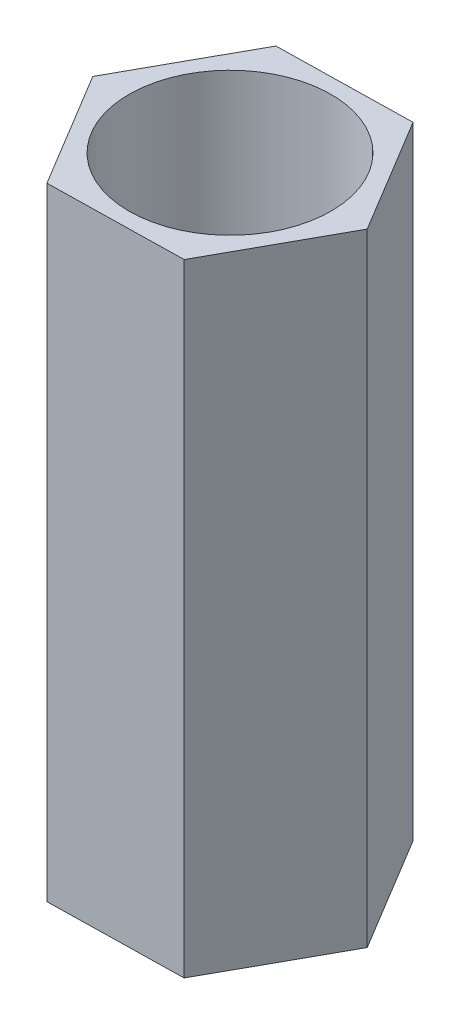
ISO-10303-21;
HEADER;
FILE_DESCRIPTION(('STEP AP214'),'2;1');
FILE_NAME('part.step','',(''),(''),'','','');
FILE_SCHEMA(('AUTOMOTIVE_DESIGN { 1 0 10303 214 1 1 1 1 }'));
ENDSEC;
DATA;
#1=APPLICATION_CONTEXT('core data for automotive mechanical design processes');
#2=APPLICATION_PROTOCOL_DEFINITION('international standard','automotive_design',2000,#1);
#3=PRODUCT_CONTEXT('',#1,'mechanical');
#4=PRODUCT('Part','Part','',(#3));
#5=PRODUCT_RELATED_PRODUCT_CATEGORY('part','',(#4));
#6=PRODUCT_DEFINITION_FORMATION('','',#4);
#7=PRODUCT_DEFINITION_CONTEXT('part definition',#1,'design');
#8=PRODUCT_DEFINITION('design','',#6,#7);
#9=PRODUCT_DEFINITION_SHAPE('','',#8);
#10=(LENGTH_UNIT() NAMED_UNIT(*) SI_UNIT(.MILLI.,.METRE.));
#11=(NAMED_UNIT(*) PLANE_ANGLE_UNIT() SI_UNIT($,.RADIAN.));
#12=(NAMED_UNIT(*) SI_UNIT($,.STERADIAN.) SOLID_ANGLE_UNIT());
#13=UNCERTAINTY_MEASURE_WITH_UNIT(LENGTH_MEASURE(1.E-05),#10,'distance_accuracy_value','');
#14=(GEOMETRIC_REPRESENTATION_CONTEXT(3) GLOBAL_UNCERTAINTY_ASSIGNED_CONTEXT((#13)) GLOBAL_UNIT_ASSIGNED_CONTEXT((#10,
#11,#12)) REPRESENTATION_CONTEXT('',''));
#15=CARTESIAN_POINT('',(0.,0.,0.));
#16=DIRECTION('',(0.,0.,1.));
#17=DIRECTION('',(1.,0.,0.));
#18=AXIS2_PLACEMENT_3D('',#15,#16,#17);
#19=CARTESIAN_POINT('',(0.,8.,0.));
#20=DIRECTION('',(0.,1.,0.));
#21=DIRECTION('',(0.,0.,1.));
#22=AXIS2_PLACEMENT_3D('',#19,#20,#21);
#23=PLANE('',#22);
#24=DIRECTION('',(0.999823393830014,0.,-0.0187931144367481));
#25=VECTOR('',#24,1.);
#26=CARTESIAN_POINT('',(-0.837682786699643,8.,1.51601040526347));
#27=LINE('',#26,#25);
#28=CARTESIAN_POINT('',(-0.837682786699643,8.,1.51601040526347));
#29=VERTEX_POINT('',#28);
#30=CARTESIAN_POINT('',(0.894062130009888,8.,1.48345977622657));
#31=VERTEX_POINT('',#30);
#32=EDGE_CURVE('E129',#29,#31,#27,.T.);
#33=ORIENTED_EDGE('',*,*,#32,.T.);
#34=DIRECTION('',(0.483636382396555,0.,-0.87526901557314));
#35=VECTOR('',#34,1.);
#36=CARTESIAN_POINT('',(0.894062130009888,8.,1.48345977622657));
#37=LINE('',#36,#35);
#38=CARTESIAN_POINT('',(1.73174491670953,8.,-0.0325506290369044));
#39=VERTEX_POINT('',#38);
#40=EDGE_CURVE('E87',#31,#39,#37,.T.);
#41=ORIENTED_EDGE('',*,*,#40,.T.);
#42=DIRECTION('',(-0.516187011433459,0.,-0.856475901136392));
#43=VECTOR('',#42,1.);
#44=CARTESIAN_POINT('',(1.73174491670953,8.,-0.0325506290369044));
#45=LINE('',#44,#43);
#46=CARTESIAN_POINT('',(0.837682786699644,8.,-1.51601040526347));
#47=VERTEX_POINT('',#46);
#48=EDGE_CURVE('E100',#39,#47,#45,.T.);
#49=ORIENTED_EDGE('',*,*,#48,.T.);
#50=DIRECTION('',(-0.999823393830014,0.,0.0187931144367482));
#51=VECTOR('',#50,1.);
#52=CARTESIAN_POINT('',(0.837682786699644,8.,-1.51601040526347));
#53=LINE('',#52,#51);
#54=CARTESIAN_POINT('',(-0.894062130009888,8.,-1.48345977622657));
#55=VERTEX_POINT('',#54);
#56=EDGE_CURVE('E94',#47,#55,#53,.T.);
#57=ORIENTED_EDGE('',*,*,#56,.T.);
#58=DIRECTION('',(-0.483636382396555,0.,0.87526901557314));
#59=VECTOR('',#58,1.);
#60=CARTESIAN_POINT('',(-0.894062130009888,8.,-1.48345977622657));
#61=LINE('',#60,#59);
#62=CARTESIAN_POINT('',(-1.73174491670953,8.,0.0325506290369043));
#63=VERTEX_POINT('',#62);
#64=EDGE_CURVE('E98',#55,#63,#61,.T.);
#65=ORIENTED_EDGE('',*,*,#64,.T.);
#66=DIRECTION('',(0.516187011433459,0.,0.856475901136391));
#67=VECTOR('',#66,1.);
#68=CARTESIAN_POINT('',(-1.73174491670953,8.,0.0325506290369043));
#69=LINE('',#68,#67);
#70=EDGE_CURVE('E50',#63,#29,#69,.T.);
#71=ORIENTED_EDGE('',*,*,#70,.T.);
#72=EDGE_LOOP('',(#33,#41,#49,#57,#65,#71));
#73=FACE_BOUND('',#72,.T.);
#74=CARTESIAN_POINT('',(0.,8.,0.));
#75=DIRECTION('',(0.,1.,0.));
#76=DIRECTION('',(0.,0.,1.));
#77=AXIS2_PLACEMENT_3D('',#74,#75,#76);
#78=CIRCLE('',#77,1.3);
#79=CARTESIAN_POINT('',(0.,8.,1.3));
#80=VERTEX_POINT('',#79);
#81=EDGE_CURVE('E122',#80,#80,#78,.T.);
#82=ORIENTED_EDGE('',*,*,#81,.F.);
#83=EDGE_LOOP('',(#82));
#84=FACE_BOUND('',#83,.T.);
#85=ADVANCED_FACE('F33',(#73,#84),#23,.T.);
#86=CARTESIAN_POINT('',(0.,0.,0.));
#87=DIRECTION('',(0.,1.,0.));
#88=DIRECTION('',(0.,0.,1.));
#89=AXIS2_PLACEMENT_3D('',#86,#87,#88);
#90=PLANE('',#89);
#91=DIRECTION('',(0.999823393830014,0.,-0.0187931144367481));
#92=VECTOR('',#91,1.);
#93=CARTESIAN_POINT('',(-0.837682786699643,0.,1.51601040526347));
#94=LINE('',#93,#92);
#95=CARTESIAN_POINT('',(-0.837682786699643,0.,1.51601040526347));
#96=VERTEX_POINT('',#95);
#97=CARTESIAN_POINT('',(0.894062130009888,0.,1.48345977622657));
#98=VERTEX_POINT('',#97);
#99=EDGE_CURVE('E118',#96,#98,#94,.T.);
#100=ORIENTED_EDGE('',*,*,#99,.F.);
#101=DIRECTION('',(0.516187011433459,0.,0.856475901136391));
#102=VECTOR('',#101,1.);
#103=CARTESIAN_POINT('',(-1.73174491670953,0.,0.0325506290369043));
#104=LINE('',#103,#102);
#105=CARTESIAN_POINT('',(-1.73174491670953,0.,0.0325506290369043));
#106=VERTEX_POINT('',#105);
#107=EDGE_CURVE('E79',#106,#96,#104,.T.);
#108=ORIENTED_EDGE('',*,*,#107,.F.);
#109=DIRECTION('',(-0.483636382396555,0.,0.87526901557314));
#110=VECTOR('',#109,1.);
#111=CARTESIAN_POINT('',(-0.894062130009888,0.,-1.48345977622657));
#112=LINE('',#111,#110);
#113=CARTESIAN_POINT('',(-0.894062130009888,0.,-1.48345977622657));
#114=VERTEX_POINT('',#113);
#115=EDGE_CURVE('E73',#114,#106,#112,.T.);
#116=ORIENTED_EDGE('',*,*,#115,.F.);
#117=DIRECTION('',(-0.999823393830014,0.,0.0187931144367482));
#118=VECTOR('',#117,1.);
#119=CARTESIAN_POINT('',(0.837682786699644,0.,-1.51601040526347));
#120=LINE('',#119,#118);
#121=CARTESIAN_POINT('',(0.837682786699644,0.,-1.51601040526347));
#122=VERTEX_POINT('',#121);
#123=EDGE_CURVE('E108',#122,#114,#120,.T.);
#124=ORIENTED_EDGE('',*,*,#123,.F.);
#125=DIRECTION('',(-0.516187011433459,0.,-0.856475901136392));
#126=VECTOR('',#125,1.);
#127=CARTESIAN_POINT('',(1.73174491670953,0.,-0.0325506290369044));
#128=LINE('',#127,#126);
#129=CARTESIAN_POINT('',(1.73174491670953,0.,-0.0325506290369044));
#130=VERTEX_POINT('',#129);
#131=EDGE_CURVE('E124',#130,#122,#128,.T.);
#132=ORIENTED_EDGE('',*,*,#131,.F.);
#133=DIRECTION('',(0.483636382396555,0.,-0.87526901557314));
#134=VECTOR('',#133,1.);
#135=CARTESIAN_POINT('',(0.894062130009888,0.,1.48345977622657));
#136=LINE('',#135,#134);
#137=EDGE_CURVE('E121',#98,#130,#136,.T.);
#138=ORIENTED_EDGE('',*,*,#137,.F.);
#139=EDGE_LOOP('',(#100,#108,#116,#124,#132,#138));
#140=FACE_BOUND('',#139,.T.);
#141=CARTESIAN_POINT('',(0.,0.,0.));
#142=DIRECTION('',(0.,1.,0.));
#143=DIRECTION('',(0.,0.,1.));
#144=AXIS2_PLACEMENT_3D('',#141,#142,#143);
#145=CIRCLE('',#144,1.3);
#146=CARTESIAN_POINT('',(0.,0.,1.3));
#147=VERTEX_POINT('',#146);
#148=EDGE_CURVE('E222',#147,#147,#145,.T.);
#149=ORIENTED_EDGE('',*,*,#148,.T.);
#150=EDGE_LOOP('',(#149));
#151=FACE_BOUND('',#150,.T.);
#152=ADVANCED_FACE('F138',(#140,#151),#90,.F.);
#153=CARTESIAN_POINT('',(-0.837682786699643,8.,1.51601040526347));
#154=DIRECTION('',(-0.0187931144367481,0.,-0.999823393830014));
#155=DIRECTION('',(-0.999823393830014,0.,0.0187931144367481));
#156=AXIS2_PLACEMENT_3D('',#153,#154,#155);
#157=PLANE('',#156);
#158=ORIENTED_EDGE('',*,*,#99,.T.);
#159=DIRECTION('',(0.,-1.,0.));
#160=VECTOR('',#159,1.);
#161=CARTESIAN_POINT('',(0.894062130009888,8.,1.48345977622657));
#162=LINE('',#161,#160);
#163=EDGE_CURVE('E11',#31,#98,#162,.T.);
#164=ORIENTED_EDGE('',*,*,#163,.F.);
#165=ORIENTED_EDGE('',*,*,#32,.F.);
#166=DIRECTION('',(0.,-1.,0.));
#167=VECTOR('',#166,1.);
#168=CARTESIAN_POINT('',(-0.837682786699643,8.,1.51601040526347));
#169=LINE('',#168,#167);
#170=EDGE_CURVE('E114',#29,#96,#169,.T.);
#171=ORIENTED_EDGE('',*,*,#170,.T.);
#172=EDGE_LOOP('',(#158,#164,#165,#171));
#173=FACE_BOUND('',#172,.T.);
#174=ADVANCED_FACE('F35',(#173),#157,.F.);
#175=CARTESIAN_POINT('',(0.894062130009888,8.,1.48345977622657));
#176=DIRECTION('',(-0.87526901557314,0.,-0.483636382396555));
#177=DIRECTION('',(-0.483636382396555,0.,0.87526901557314));
#178=AXIS2_PLACEMENT_3D('',#175,#176,#177);
#179=PLANE('',#178);
#180=ORIENTED_EDGE('',*,*,#137,.T.);
#181=DIRECTION('',(0.,-1.,0.));
#182=VECTOR('',#181,1.);
#183=CARTESIAN_POINT('',(1.73174491670953,8.,-0.0325506290369044));
#184=LINE('',#183,#182);
#185=EDGE_CURVE('E42',#39,#130,#184,.T.);
#186=ORIENTED_EDGE('',*,*,#185,.F.);
#187=ORIENTED_EDGE('',*,*,#40,.F.);
#188=ORIENTED_EDGE('',*,*,#163,.T.);
#189=EDGE_LOOP('',(#180,#186,#187,#188));
#190=FACE_BOUND('',#189,.T.);
#191=ADVANCED_FACE('F163',(#190),#179,.F.);
#192=CARTESIAN_POINT('',(1.73174491670953,8.,-0.0325506290369044));
#193=DIRECTION('',(-0.856475901136392,0.,0.516187011433459));
#194=DIRECTION('',(0.516187011433459,0.,0.856475901136392));
#195=AXIS2_PLACEMENT_3D('',#192,#193,#194);
#196=PLANE('',#195);
#197=ORIENTED_EDGE('',*,*,#131,.T.);
#198=DIRECTION('',(0.,-1.,0.));
#199=VECTOR('',#198,1.);
#200=CARTESIAN_POINT('',(0.837682786699644,8.,-1.51601040526347));
#201=LINE('',#200,#199);
#202=EDGE_CURVE('E109',#47,#122,#201,.T.);
#203=ORIENTED_EDGE('',*,*,#202,.F.);
#204=ORIENTED_EDGE('',*,*,#48,.F.);
#205=ORIENTED_EDGE('',*,*,#185,.T.);
#206=EDGE_LOOP('',(#197,#203,#204,#205));
#207=FACE_BOUND('',#206,.T.);
#208=ADVANCED_FACE('F135',(#207),#196,.F.);
#209=CARTESIAN_POINT('',(0.837682786699644,8.,-1.51601040526347));
#210=DIRECTION('',(0.0187931144367482,0.,0.999823393830014));
#211=DIRECTION('',(0.999823393830014,0.,-0.0187931144367482));
#212=AXIS2_PLACEMENT_3D('',#209,#210,#211);
#213=PLANE('',#212);
#214=ORIENTED_EDGE('',*,*,#123,.T.);
#215=DIRECTION('',(0.,-1.,0.));
#216=VECTOR('',#215,1.);
#217=CARTESIAN_POINT('',(-0.894062130009888,8.,-1.48345977622657));
#218=LINE('',#217,#216);
#219=EDGE_CURVE('E105',#55,#114,#218,.T.);
#220=ORIENTED_EDGE('',*,*,#219,.F.);
#221=ORIENTED_EDGE('',*,*,#56,.F.);
#222=ORIENTED_EDGE('',*,*,#202,.T.);
#223=EDGE_LOOP('',(#214,#220,#221,#222));
#224=FACE_BOUND('',#223,.T.);
#225=ADVANCED_FACE('F106',(#224),#213,.F.);
#226=CARTESIAN_POINT('',(-0.894062130009888,8.,-1.48345977622657));
#227=DIRECTION('',(0.87526901557314,0.,0.483636382396555));
#228=DIRECTION('',(0.483636382396555,0.,-0.87526901557314));
#229=AXIS2_PLACEMENT_3D('',#226,#227,#228);
#230=PLANE('',#229);
#231=ORIENTED_EDGE('',*,*,#115,.T.);
#232=DIRECTION('',(0.,-1.,0.));
#233=VECTOR('',#232,1.);
#234=CARTESIAN_POINT('',(-1.73174491670953,8.,0.0325506290369043));
#235=LINE('',#234,#233);
#236=EDGE_CURVE('E110',#63,#106,#235,.T.);
#237=ORIENTED_EDGE('',*,*,#236,.F.);
#238=ORIENTED_EDGE('',*,*,#64,.F.);
#239=ORIENTED_EDGE('',*,*,#219,.T.);
#240=EDGE_LOOP('',(#231,#237,#238,#239));
#241=FACE_BOUND('',#240,.T.);
#242=ADVANCED_FACE('F112',(#241),#230,.F.);
#243=CARTESIAN_POINT('',(-1.73174491670953,8.,0.0325506290369043));
#244=DIRECTION('',(0.856475901136391,0.,-0.516187011433459));
#245=DIRECTION('',(-0.516187011433459,0.,-0.856475901136392));
#246=AXIS2_PLACEMENT_3D('',#243,#244,#245);
#247=PLANE('',#246);
#248=ORIENTED_EDGE('',*,*,#107,.T.);
#249=ORIENTED_EDGE('',*,*,#170,.F.);
#250=ORIENTED_EDGE('',*,*,#70,.F.);
#251=ORIENTED_EDGE('',*,*,#236,.T.);
#252=EDGE_LOOP('',(#248,#249,#250,#251));
#253=FACE_BOUND('',#252,.T.);
#254=ADVANCED_FACE('F143',(#253),#247,.F.);
#255=CARTESIAN_POINT('',(0.,8.,0.));
#256=DIRECTION('',(0.,-1.,0.));
#257=DIRECTION('',(0.,0.,-1.));
#258=AXIS2_PLACEMENT_3D('',#255,#256,#257);
#259=CYLINDRICAL_SURFACE('',#258,1.3);
#260=ORIENTED_EDGE('',*,*,#81,.T.);
#261=EDGE_LOOP('',(#260));
#262=FACE_BOUND('',#261,.T.);
#263=ORIENTED_EDGE('',*,*,#148,.F.);
#264=EDGE_LOOP('',(#263));
#265=FACE_BOUND('',#264,.T.);
#266=ADVANCED_FACE('F145',(#262,#265),#259,.F.);
#267=CLOSED_SHELL('',(#85,#152,#174,#191,#208,#225,#242,#254,#266));
#268=MANIFOLD_SOLID_BREP('B2',#267);
#269=ADVANCED_BREP_SHAPE_REPRESENTATION('',(#18,#268),#14);
#270=SHAPE_DEFINITION_REPRESENTATION(#9,#269);
ENDSEC;
END-ISO-10303-21;
